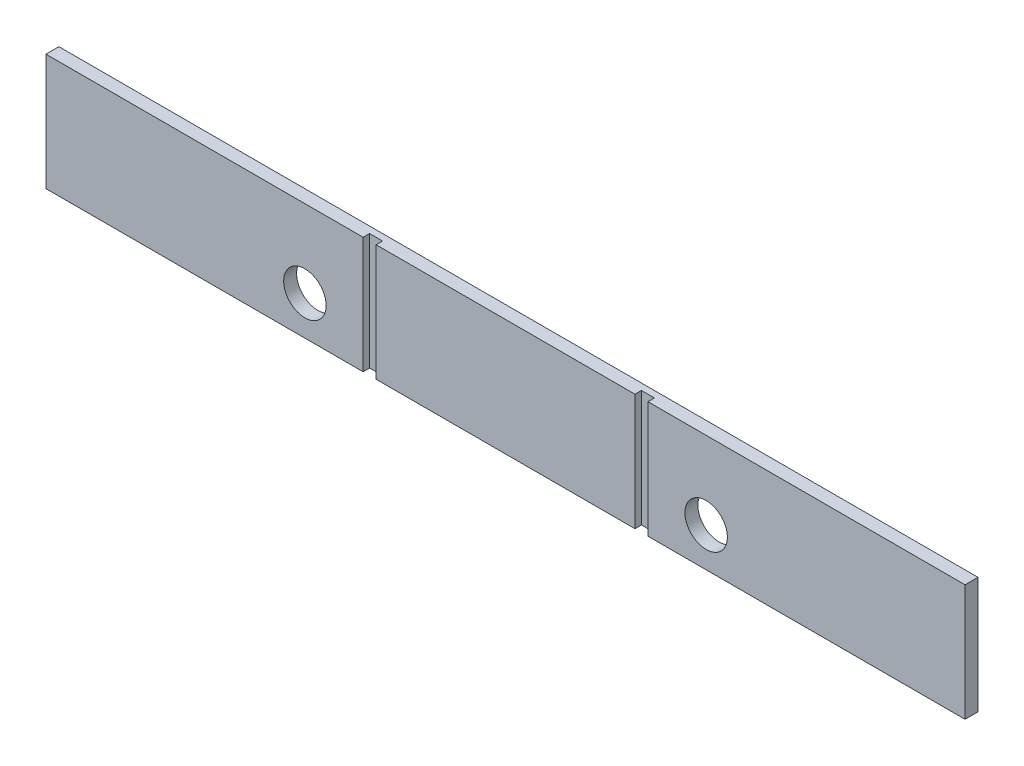
ISO-10303-21;
HEADER;
FILE_DESCRIPTION(('STEP AP214'),'2;1');
FILE_NAME('part.step','',(''),(''),'','','');
FILE_SCHEMA(('AUTOMOTIVE_DESIGN { 1 0 10303 214 1 1 1 1 }'));
ENDSEC;
DATA;
#1=APPLICATION_CONTEXT('core data for automotive mechanical design processes');
#2=APPLICATION_PROTOCOL_DEFINITION('international standard','automotive_design',2000,#1);
#3=PRODUCT_CONTEXT('',#1,'mechanical');
#4=PRODUCT('Part','Part','',(#3));
#5=PRODUCT_RELATED_PRODUCT_CATEGORY('part','',(#4));
#6=PRODUCT_DEFINITION_FORMATION('','',#4);
#7=PRODUCT_DEFINITION_CONTEXT('part definition',#1,'design');
#8=PRODUCT_DEFINITION('design','',#6,#7);
#9=PRODUCT_DEFINITION_SHAPE('','',#8);
#10=(LENGTH_UNIT() NAMED_UNIT(*) SI_UNIT(.MILLI.,.METRE.));
#11=(NAMED_UNIT(*) PLANE_ANGLE_UNIT() SI_UNIT($,.RADIAN.));
#12=(NAMED_UNIT(*) SI_UNIT($,.STERADIAN.) SOLID_ANGLE_UNIT());
#13=UNCERTAINTY_MEASURE_WITH_UNIT(LENGTH_MEASURE(1.E-05),#10,'distance_accuracy_value','');
#14=(GEOMETRIC_REPRESENTATION_CONTEXT(3) GLOBAL_UNCERTAINTY_ASSIGNED_CONTEXT((#13)) GLOBAL_UNIT_ASSIGNED_CONTEXT((#10,
#11,#12)) REPRESENTATION_CONTEXT('',''));
#15=CARTESIAN_POINT('',(0.,0.,0.));
#16=DIRECTION('',(0.,0.,1.));
#17=DIRECTION('',(1.,0.,0.));
#18=AXIS2_PLACEMENT_3D('',#15,#16,#17);
#19=CARTESIAN_POINT('',(0.,0.,12.7));
#20=DIRECTION('',(0.,0.,-1.));
#21=DIRECTION('',(-1.,0.,0.));
#22=AXIS2_PLACEMENT_3D('',#19,#20,#21);
#23=PLANE('',#22);
#24=DIRECTION('',(1.,0.,0.));
#25=VECTOR('',#24,1.);
#26=CARTESIAN_POINT('',(0.,0.,12.7));
#27=LINE('',#26,#25);
#28=CARTESIAN_POINT('',(323.85,0.,12.7));
#29=VERTEX_POINT('',#28);
#30=CARTESIAN_POINT('',(577.85,0.,12.7));
#31=VERTEX_POINT('',#30);
#32=EDGE_CURVE('E198',#29,#31,#27,.T.);
#33=ORIENTED_EDGE('',*,*,#32,.T.);
#34=DIRECTION('',(0.,-1.,0.));
#35=VECTOR('',#34,1.);
#36=CARTESIAN_POINT('',(577.85,114.3,12.7));
#37=LINE('',#36,#35);
#38=CARTESIAN_POINT('',(577.85,114.3,12.7));
#39=VERTEX_POINT('',#38);
#40=EDGE_CURVE('E130',#39,#31,#37,.T.);
#41=ORIENTED_EDGE('',*,*,#40,.F.);
#42=DIRECTION('',(-1.,0.,0.));
#43=VECTOR('',#42,1.);
#44=CARTESIAN_POINT('',(0.,114.3,12.7));
#45=LINE('',#44,#43);
#46=CARTESIAN_POINT('',(323.85,114.3,12.7));
#47=VERTEX_POINT('',#46);
#48=EDGE_CURVE('E205',#39,#47,#45,.T.);
#49=ORIENTED_EDGE('',*,*,#48,.T.);
#50=DIRECTION('',(0.,1.,0.));
#51=VECTOR('',#50,1.);
#52=CARTESIAN_POINT('',(323.85,114.3,12.7));
#53=LINE('',#52,#51);
#54=EDGE_CURVE('E168',#29,#47,#53,.T.);
#55=ORIENTED_EDGE('',*,*,#54,.F.);
#56=EDGE_LOOP('',(#33,#41,#49,#55));
#57=FACE_BOUND('',#56,.T.);
#58=ADVANCED_FACE('F35',(#57),#23,.F.);
#59=CARTESIAN_POINT('',(254.,38.1000000000008,12.7));
#60=DIRECTION('',(0.,0.,-1.));
#61=DIRECTION('',(-1.,0.,0.));
#62=AXIS2_PLACEMENT_3D('',#59,#60,#61);
#63=CIRCLE('',#62,20.8279999999999);
#64=CARTESIAN_POINT('',(233.172,38.1000000000008,12.7));
#65=VERTEX_POINT('',#64);
#66=EDGE_CURVE('E282',#65,#65,#63,.F.);
#67=ORIENTED_EDGE('',*,*,#66,.F.);
#68=EDGE_LOOP('',(#67));
#69=FACE_BOUND('',#68,.T.);
#70=CARTESIAN_POINT('',(0.,0.,12.7));
#71=VERTEX_POINT('',#70);
#72=CARTESIAN_POINT('',(311.15,0.,12.7));
#73=VERTEX_POINT('',#72);
#74=EDGE_CURVE('E194',#71,#73,#27,.T.);
#75=ORIENTED_EDGE('',*,*,#74,.T.);
#76=DIRECTION('',(0.,-1.,0.));
#77=VECTOR('',#76,1.);
#78=CARTESIAN_POINT('',(311.15,114.3,12.7));
#79=LINE('',#78,#77);
#80=CARTESIAN_POINT('',(311.15,114.3,12.7));
#81=VERTEX_POINT('',#80);
#82=EDGE_CURVE('E159',#81,#73,#79,.T.);
#83=ORIENTED_EDGE('',*,*,#82,.F.);
#84=CARTESIAN_POINT('',(0.,114.3,12.7));
#85=VERTEX_POINT('',#84);
#86=EDGE_CURVE('E200',#81,#85,#45,.T.);
#87=ORIENTED_EDGE('',*,*,#86,.T.);
#88=DIRECTION('',(0.,-1.,0.));
#89=VECTOR('',#88,1.);
#90=CARTESIAN_POINT('',(0.,0.,12.7));
#91=LINE('',#90,#89);
#92=EDGE_CURVE('E189',#85,#71,#91,.T.);
#93=ORIENTED_EDGE('',*,*,#92,.T.);
#94=EDGE_LOOP('',(#75,#83,#87,#93));
#95=FACE_BOUND('',#94,.T.);
#96=ADVANCED_FACE('F238',(#69,#95),#23,.F.);
#97=CARTESIAN_POINT('',(0.,0.,12.7));
#98=DIRECTION('',(1.,0.,0.));
#99=DIRECTION('',(0.,0.,-1.));
#100=AXIS2_PLACEMENT_3D('',#97,#98,#99);
#101=PLANE('',#100);
#102=DIRECTION('',(0.,-1.,0.));
#103=VECTOR('',#102,1.);
#104=CARTESIAN_POINT('',(0.,0.,0.));
#105=LINE('',#104,#103);
#106=CARTESIAN_POINT('',(0.,114.3,0.));
#107=VERTEX_POINT('',#106);
#108=CARTESIAN_POINT('',(0.,0.,0.));
#109=VERTEX_POINT('',#108);
#110=EDGE_CURVE('E182',#107,#109,#105,.T.);
#111=ORIENTED_EDGE('',*,*,#110,.T.);
#112=DIRECTION('',(0.,0.,-1.));
#113=VECTOR('',#112,1.);
#114=CARTESIAN_POINT('',(0.,0.,12.7));
#115=LINE('',#114,#113);
#116=EDGE_CURVE('E11',#71,#109,#115,.T.);
#117=ORIENTED_EDGE('',*,*,#116,.F.);
#118=ORIENTED_EDGE('',*,*,#92,.F.);
#119=DIRECTION('',(0.,0.,-1.));
#120=VECTOR('',#119,1.);
#121=CARTESIAN_POINT('',(0.,114.3,12.7));
#122=LINE('',#121,#120);
#123=EDGE_CURVE('E204',#85,#107,#122,.T.);
#124=ORIENTED_EDGE('',*,*,#123,.T.);
#125=EDGE_LOOP('',(#111,#117,#118,#124));
#126=FACE_BOUND('',#125,.T.);
#127=ADVANCED_FACE('F37',(#126),#101,.F.);
#128=CARTESIAN_POINT('',(0.,0.,12.7));
#129=DIRECTION('',(0.,1.,0.));
#130=DIRECTION('',(0.,0.,1.));
#131=AXIS2_PLACEMENT_3D('',#128,#129,#130);
#132=PLANE('',#131);
#133=DIRECTION('',(1.,0.,0.));
#134=VECTOR('',#133,1.);
#135=CARTESIAN_POINT('',(577.85,0.,6.35));
#136=LINE('',#135,#134);
#137=CARTESIAN_POINT('',(577.85,0.,6.35));
#138=VERTEX_POINT('',#137);
#139=CARTESIAN_POINT('',(590.55,0.,6.35));
#140=VERTEX_POINT('',#139);
#141=EDGE_CURVE('E141',#138,#140,#136,.T.);
#142=ORIENTED_EDGE('',*,*,#141,.F.);
#143=DIRECTION('',(0.,0.,1.));
#144=VECTOR('',#143,1.);
#145=CARTESIAN_POINT('',(577.85,0.,6.35));
#146=LINE('',#145,#144);
#147=EDGE_CURVE('E124',#138,#31,#146,.T.);
#148=ORIENTED_EDGE('',*,*,#147,.T.);
#149=ORIENTED_EDGE('',*,*,#32,.F.);
#150=DIRECTION('',(0.,0.,1.));
#151=VECTOR('',#150,1.);
#152=CARTESIAN_POINT('',(323.85,0.,6.35));
#153=LINE('',#152,#151);
#154=CARTESIAN_POINT('',(323.85,0.,6.35));
#155=VERTEX_POINT('',#154);
#156=EDGE_CURVE('E58',#155,#29,#153,.T.);
#157=ORIENTED_EDGE('',*,*,#156,.F.);
#158=DIRECTION('',(1.,0.,0.));
#159=VECTOR('',#158,1.);
#160=CARTESIAN_POINT('',(311.15,0.,6.35));
#161=LINE('',#160,#159);
#162=CARTESIAN_POINT('',(311.15,0.,6.35));
#163=VERTEX_POINT('',#162);
#164=EDGE_CURVE('E167',#163,#155,#161,.T.);
#165=ORIENTED_EDGE('',*,*,#164,.F.);
#166=DIRECTION('',(0.,0.,1.));
#167=VECTOR('',#166,1.);
#168=CARTESIAN_POINT('',(311.15,0.,6.35));
#169=LINE('',#168,#167);
#170=EDGE_CURVE('E177',#163,#73,#169,.T.);
#171=ORIENTED_EDGE('',*,*,#170,.T.);
#172=ORIENTED_EDGE('',*,*,#74,.F.);
#173=ORIENTED_EDGE('',*,*,#116,.T.);
#174=DIRECTION('',(1.,0.,0.));
#175=VECTOR('',#174,1.);
#176=CARTESIAN_POINT('',(0.,0.,0.));
#177=LINE('',#176,#175);
#178=CARTESIAN_POINT('',(901.7,0.,0.));
#179=VERTEX_POINT('',#178);
#180=EDGE_CURVE('E208',#109,#179,#177,.T.);
#181=ORIENTED_EDGE('',*,*,#180,.T.);
#182=DIRECTION('',(0.,0.,-1.));
#183=VECTOR('',#182,1.);
#184=CARTESIAN_POINT('',(901.7,0.,12.7));
#185=LINE('',#184,#183);
#186=CARTESIAN_POINT('',(901.7,0.,12.7));
#187=VERTEX_POINT('',#186);
#188=EDGE_CURVE('E43',#187,#179,#185,.T.);
#189=ORIENTED_EDGE('',*,*,#188,.F.);
#190=CARTESIAN_POINT('',(590.55,0.,12.7));
#191=VERTEX_POINT('',#190);
#192=EDGE_CURVE('E192',#191,#187,#27,.T.);
#193=ORIENTED_EDGE('',*,*,#192,.F.);
#194=DIRECTION('',(0.,0.,1.));
#195=VECTOR('',#194,1.);
#196=CARTESIAN_POINT('',(590.55,0.,6.35));
#197=LINE('',#196,#195);
#198=EDGE_CURVE('E50',#140,#191,#197,.T.);
#199=ORIENTED_EDGE('',*,*,#198,.F.);
#200=EDGE_LOOP('',(#142,#148,#149,#157,#165,#171,#172,#173,#181,#189,#193,#199));
#201=FACE_BOUND('',#200,.T.);
#202=ADVANCED_FACE('F146',(#201),#132,.F.);
#203=CARTESIAN_POINT('',(901.7,0.,12.7));
#204=DIRECTION('',(-1.,0.,0.));
#205=DIRECTION('',(0.,0.,1.));
#206=AXIS2_PLACEMENT_3D('',#203,#204,#205);
#207=PLANE('',#206);
#208=DIRECTION('',(0.,1.,0.));
#209=VECTOR('',#208,1.);
#210=CARTESIAN_POINT('',(901.7,0.,0.));
#211=LINE('',#210,#209);
#212=CARTESIAN_POINT('',(901.7,114.3,0.));
#213=VERTEX_POINT('',#212);
#214=EDGE_CURVE('E210',#179,#213,#211,.T.);
#215=ORIENTED_EDGE('',*,*,#214,.T.);
#216=DIRECTION('',(0.,0.,-1.));
#217=VECTOR('',#216,1.);
#218=CARTESIAN_POINT('',(901.7,114.3,12.7));
#219=LINE('',#218,#217);
#220=CARTESIAN_POINT('',(901.7,114.3,12.7));
#221=VERTEX_POINT('',#220);
#222=EDGE_CURVE('E215',#221,#213,#219,.T.);
#223=ORIENTED_EDGE('',*,*,#222,.F.);
#224=DIRECTION('',(0.,1.,0.));
#225=VECTOR('',#224,1.);
#226=CARTESIAN_POINT('',(901.7,0.,12.7));
#227=LINE('',#226,#225);
#228=EDGE_CURVE('E197',#187,#221,#227,.T.);
#229=ORIENTED_EDGE('',*,*,#228,.F.);
#230=ORIENTED_EDGE('',*,*,#188,.T.);
#231=EDGE_LOOP('',(#215,#223,#229,#230));
#232=FACE_BOUND('',#231,.T.);
#233=ADVANCED_FACE('F222',(#232),#207,.F.);
#234=CARTESIAN_POINT('',(0.,114.3,12.7));
#235=DIRECTION('',(0.,-1.,0.));
#236=DIRECTION('',(0.,0.,-1.));
#237=AXIS2_PLACEMENT_3D('',#234,#235,#236);
#238=PLANE('',#237);
#239=ORIENTED_EDGE('',*,*,#48,.F.);
#240=DIRECTION('',(0.,0.,1.));
#241=VECTOR('',#240,1.);
#242=CARTESIAN_POINT('',(577.85,114.3,6.35));
#243=LINE('',#242,#241);
#244=CARTESIAN_POINT('',(577.85,114.3,6.35));
#245=VERTEX_POINT('',#244);
#246=EDGE_CURVE('E157',#245,#39,#243,.T.);
#247=ORIENTED_EDGE('',*,*,#246,.F.);
#248=DIRECTION('',(-1.,0.,0.));
#249=VECTOR('',#248,1.);
#250=CARTESIAN_POINT('',(577.85,114.3,6.35));
#251=LINE('',#250,#249);
#252=CARTESIAN_POINT('',(590.55,114.3,6.35));
#253=VERTEX_POINT('',#252);
#254=EDGE_CURVE('E135',#253,#245,#251,.T.);
#255=ORIENTED_EDGE('',*,*,#254,.F.);
#256=DIRECTION('',(0.,0.,1.));
#257=VECTOR('',#256,1.);
#258=CARTESIAN_POINT('',(590.55,114.3,6.35));
#259=LINE('',#258,#257);
#260=CARTESIAN_POINT('',(590.55,114.3,12.7));
#261=VERTEX_POINT('',#260);
#262=EDGE_CURVE('E160',#253,#261,#259,.T.);
#263=ORIENTED_EDGE('',*,*,#262,.T.);
#264=EDGE_CURVE('E201',#221,#261,#45,.T.);
#265=ORIENTED_EDGE('',*,*,#264,.F.);
#266=ORIENTED_EDGE('',*,*,#222,.T.);
#267=DIRECTION('',(-1.,0.,0.));
#268=VECTOR('',#267,1.);
#269=CARTESIAN_POINT('',(0.,114.3,0.));
#270=LINE('',#269,#268);
#271=EDGE_CURVE('E193',#213,#107,#270,.T.);
#272=ORIENTED_EDGE('',*,*,#271,.T.);
#273=ORIENTED_EDGE('',*,*,#123,.F.);
#274=ORIENTED_EDGE('',*,*,#86,.F.);
#275=DIRECTION('',(0.,0.,1.));
#276=VECTOR('',#275,1.);
#277=CARTESIAN_POINT('',(311.15,114.3,6.35));
#278=LINE('',#277,#276);
#279=CARTESIAN_POINT('',(311.15,114.3,6.35));
#280=VERTEX_POINT('',#279);
#281=EDGE_CURVE('E180',#280,#81,#278,.T.);
#282=ORIENTED_EDGE('',*,*,#281,.F.);
#283=DIRECTION('',(-1.,0.,0.));
#284=VECTOR('',#283,1.);
#285=CARTESIAN_POINT('',(311.15,114.3,6.35));
#286=LINE('',#285,#284);
#287=CARTESIAN_POINT('',(323.85,114.3,6.35));
#288=VERTEX_POINT('',#287);
#289=EDGE_CURVE('E174',#288,#280,#286,.T.);
#290=ORIENTED_EDGE('',*,*,#289,.F.);
#291=DIRECTION('',(0.,0.,1.));
#292=VECTOR('',#291,1.);
#293=CARTESIAN_POINT('',(323.85,114.3,6.35));
#294=LINE('',#293,#292);
#295=EDGE_CURVE('E183',#288,#47,#294,.T.);
#296=ORIENTED_EDGE('',*,*,#295,.T.);
#297=EDGE_LOOP('',(#239,#247,#255,#263,#265,#266,#272,#273,#274,#282,#290,#296));
#298=FACE_BOUND('',#297,.T.);
#299=ADVANCED_FACE('F231',(#298),#238,.F.);
#300=CARTESIAN_POINT('',(647.7,38.1,12.7));
#301=DIRECTION('',(0.,0.,-1.));
#302=DIRECTION('',(-1.,0.,0.));
#303=AXIS2_PLACEMENT_3D('',#300,#301,#302);
#304=CIRCLE('',#303,20.8279999999999);
#305=CARTESIAN_POINT('',(626.872,38.1,12.7));
#306=VERTEX_POINT('',#305);
#307=EDGE_CURVE('E155',#306,#306,#304,.F.);
#308=ORIENTED_EDGE('',*,*,#307,.F.);
#309=EDGE_LOOP('',(#308));
#310=FACE_BOUND('',#309,.T.);
#311=ORIENTED_EDGE('',*,*,#264,.T.);
#312=DIRECTION('',(0.,1.,0.));
#313=VECTOR('',#312,1.);
#314=CARTESIAN_POINT('',(590.55,114.3,12.7));
#315=LINE('',#314,#313);
#316=EDGE_CURVE('E144',#191,#261,#315,.T.);
#317=ORIENTED_EDGE('',*,*,#316,.F.);
#318=ORIENTED_EDGE('',*,*,#192,.T.);
#319=ORIENTED_EDGE('',*,*,#228,.T.);
#320=EDGE_LOOP('',(#311,#317,#318,#319));
#321=FACE_BOUND('',#320,.T.);
#322=ADVANCED_FACE('F248',(#310,#321),#23,.F.);
#323=CARTESIAN_POINT('',(0.,0.,0.));
#324=DIRECTION('',(0.,0.,-1.));
#325=DIRECTION('',(-1.,0.,0.));
#326=AXIS2_PLACEMENT_3D('',#323,#324,#325);
#327=PLANE('',#326);
#328=CARTESIAN_POINT('',(254.,38.1000000000008,0.));
#329=DIRECTION('',(0.,0.,-1.));
#330=DIRECTION('',(1.,0.,0.));
#331=AXIS2_PLACEMENT_3D('',#328,#329,#330);
#332=CIRCLE('',#331,20.8279999999999);
#333=CARTESIAN_POINT('',(274.828,38.1000000000008,0.));
#334=VERTEX_POINT('',#333);
#335=EDGE_CURVE('E287',#334,#334,#332,.T.);
#336=ORIENTED_EDGE('',*,*,#335,.F.);
#337=EDGE_LOOP('',(#336));
#338=FACE_BOUND('',#337,.T.);
#339=CARTESIAN_POINT('',(647.7,38.1,0.));
#340=DIRECTION('',(0.,0.,-1.));
#341=DIRECTION('',(-1.,0.,0.));
#342=AXIS2_PLACEMENT_3D('',#339,#340,#341);
#343=CIRCLE('',#342,20.8279999999999);
#344=CARTESIAN_POINT('',(626.872,38.1,0.));
#345=VERTEX_POINT('',#344);
#346=EDGE_CURVE('E280',#345,#345,#343,.T.);
#347=ORIENTED_EDGE('',*,*,#346,.F.);
#348=EDGE_LOOP('',(#347));
#349=FACE_BOUND('',#348,.T.);
#350=ORIENTED_EDGE('',*,*,#110,.F.);
#351=ORIENTED_EDGE('',*,*,#271,.F.);
#352=ORIENTED_EDGE('',*,*,#214,.F.);
#353=ORIENTED_EDGE('',*,*,#180,.F.);
#354=EDGE_LOOP('',(#350,#351,#352,#353));
#355=FACE_BOUND('',#354,.T.);
#356=ADVANCED_FACE('F227',(#338,#349,#355),#327,.T.);
#357=CARTESIAN_POINT('',(311.15,114.3,6.35));
#358=DIRECTION('',(-1.,0.,0.));
#359=DIRECTION('',(0.,-1.,0.));
#360=AXIS2_PLACEMENT_3D('',#357,#358,#359);
#361=PLANE('',#360);
#362=ORIENTED_EDGE('',*,*,#82,.T.);
#363=ORIENTED_EDGE('',*,*,#170,.F.);
#364=DIRECTION('',(0.,-1.,0.));
#365=VECTOR('',#364,1.);
#366=CARTESIAN_POINT('',(311.15,114.3,6.35));
#367=LINE('',#366,#365);
#368=EDGE_CURVE('E164',#280,#163,#367,.T.);
#369=ORIENTED_EDGE('',*,*,#368,.F.);
#370=ORIENTED_EDGE('',*,*,#281,.T.);
#371=EDGE_LOOP('',(#362,#363,#369,#370));
#372=FACE_BOUND('',#371,.T.);
#373=ADVANCED_FACE('F273',(#372),#361,.F.);
#374=CARTESIAN_POINT('',(323.85,114.3,6.35));
#375=DIRECTION('',(1.,0.,0.));
#376=DIRECTION('',(0.,0.,-1.));
#377=AXIS2_PLACEMENT_3D('',#374,#375,#376);
#378=PLANE('',#377);
#379=ORIENTED_EDGE('',*,*,#54,.T.);
#380=ORIENTED_EDGE('',*,*,#295,.F.);
#381=DIRECTION('',(0.,1.,0.));
#382=VECTOR('',#381,1.);
#383=CARTESIAN_POINT('',(323.85,114.3,6.35));
#384=LINE('',#383,#382);
#385=EDGE_CURVE('E171',#155,#288,#384,.T.);
#386=ORIENTED_EDGE('',*,*,#385,.F.);
#387=ORIENTED_EDGE('',*,*,#156,.T.);
#388=EDGE_LOOP('',(#379,#380,#386,#387));
#389=FACE_BOUND('',#388,.T.);
#390=ADVANCED_FACE('F242',(#389),#378,.F.);
#391=CARTESIAN_POINT('',(0.,0.,6.35));
#392=DIRECTION('',(0.,0.,1.));
#393=DIRECTION('',(1.,0.,0.));
#394=AXIS2_PLACEMENT_3D('',#391,#392,#393);
#395=PLANE('',#394);
#396=ORIENTED_EDGE('',*,*,#368,.T.);
#397=ORIENTED_EDGE('',*,*,#164,.T.);
#398=ORIENTED_EDGE('',*,*,#385,.T.);
#399=ORIENTED_EDGE('',*,*,#289,.T.);
#400=EDGE_LOOP('',(#396,#397,#398,#399));
#401=FACE_BOUND('',#400,.T.);
#402=ADVANCED_FACE('F245',(#401),#395,.T.);
#403=CARTESIAN_POINT('',(577.85,114.3,6.35));
#404=DIRECTION('',(-1.,0.,0.));
#405=DIRECTION('',(0.,0.,1.));
#406=AXIS2_PLACEMENT_3D('',#403,#404,#405);
#407=PLANE('',#406);
#408=ORIENTED_EDGE('',*,*,#40,.T.);
#409=ORIENTED_EDGE('',*,*,#147,.F.);
#410=DIRECTION('',(0.,-1.,0.));
#411=VECTOR('',#410,1.);
#412=CARTESIAN_POINT('',(577.85,114.3,6.35));
#413=LINE('',#412,#411);
#414=EDGE_CURVE('E127',#245,#138,#413,.T.);
#415=ORIENTED_EDGE('',*,*,#414,.F.);
#416=ORIENTED_EDGE('',*,*,#246,.T.);
#417=EDGE_LOOP('',(#408,#409,#415,#416));
#418=FACE_BOUND('',#417,.T.);
#419=ADVANCED_FACE('F126',(#418),#407,.F.);
#420=CARTESIAN_POINT('',(590.55,114.3,6.35));
#421=DIRECTION('',(1.,0.,0.));
#422=DIRECTION('',(0.,0.,-1.));
#423=AXIS2_PLACEMENT_3D('',#420,#421,#422);
#424=PLANE('',#423);
#425=ORIENTED_EDGE('',*,*,#316,.T.);
#426=ORIENTED_EDGE('',*,*,#262,.F.);
#427=DIRECTION('',(0.,1.,0.));
#428=VECTOR('',#427,1.);
#429=CARTESIAN_POINT('',(590.55,114.3,6.35));
#430=LINE('',#429,#428);
#431=EDGE_CURVE('E148',#140,#253,#430,.T.);
#432=ORIENTED_EDGE('',*,*,#431,.F.);
#433=ORIENTED_EDGE('',*,*,#198,.T.);
#434=EDGE_LOOP('',(#425,#426,#432,#433));
#435=FACE_BOUND('',#434,.T.);
#436=ADVANCED_FACE('F249',(#435),#424,.F.);
#437=CARTESIAN_POINT('',(0.,0.,6.35));
#438=DIRECTION('',(0.,0.,1.));
#439=DIRECTION('',(1.,0.,0.));
#440=AXIS2_PLACEMENT_3D('',#437,#438,#439);
#441=PLANE('',#440);
#442=ORIENTED_EDGE('',*,*,#414,.T.);
#443=ORIENTED_EDGE('',*,*,#141,.T.);
#444=ORIENTED_EDGE('',*,*,#431,.T.);
#445=ORIENTED_EDGE('',*,*,#254,.T.);
#446=EDGE_LOOP('',(#442,#443,#444,#445));
#447=FACE_BOUND('',#446,.T.);
#448=ADVANCED_FACE('F139',(#447),#441,.T.);
#449=CARTESIAN_POINT('',(647.7,38.1,12.701));
#450=DIRECTION('',(0.,0.,-1.));
#451=DIRECTION('',(-1.,0.,0.));
#452=AXIS2_PLACEMENT_3D('',#449,#450,#451);
#453=CYLINDRICAL_SURFACE('',#452,20.8279999999999);
#454=ORIENTED_EDGE('',*,*,#346,.T.);
#455=EDGE_LOOP('',(#454));
#456=FACE_BOUND('',#455,.T.);
#457=ORIENTED_EDGE('',*,*,#307,.T.);
#458=EDGE_LOOP('',(#457));
#459=FACE_BOUND('',#458,.T.);
#460=ADVANCED_FACE('F256',(#456,#459),#453,.F.);
#461=CARTESIAN_POINT('',(254.,38.1000000000008,12.701));
#462=DIRECTION('',(0.,0.,-1.));
#463=DIRECTION('',(-1.,0.,0.));
#464=AXIS2_PLACEMENT_3D('',#461,#462,#463);
#465=CYLINDRICAL_SURFACE('',#464,20.8279999999999);
#466=ORIENTED_EDGE('',*,*,#335,.T.);
#467=EDGE_LOOP('',(#466));
#468=FACE_BOUND('',#467,.T.);
#469=ORIENTED_EDGE('',*,*,#66,.T.);
#470=EDGE_LOOP('',(#469));
#471=FACE_BOUND('',#470,.T.);
#472=ADVANCED_FACE('F291',(#468,#471),#465,.F.);
#473=CLOSED_SHELL('',(#58,#96,#127,#202,#233,#299,#322,#356,#373,#390,#402,#419,#436,#448,#460,#472));
#474=MANIFOLD_SOLID_BREP('B2',#473);
#475=ADVANCED_BREP_SHAPE_REPRESENTATION('',(#18,#474),#14);
#476=SHAPE_DEFINITION_REPRESENTATION(#9,#475);
ENDSEC;
END-ISO-10303-21;
